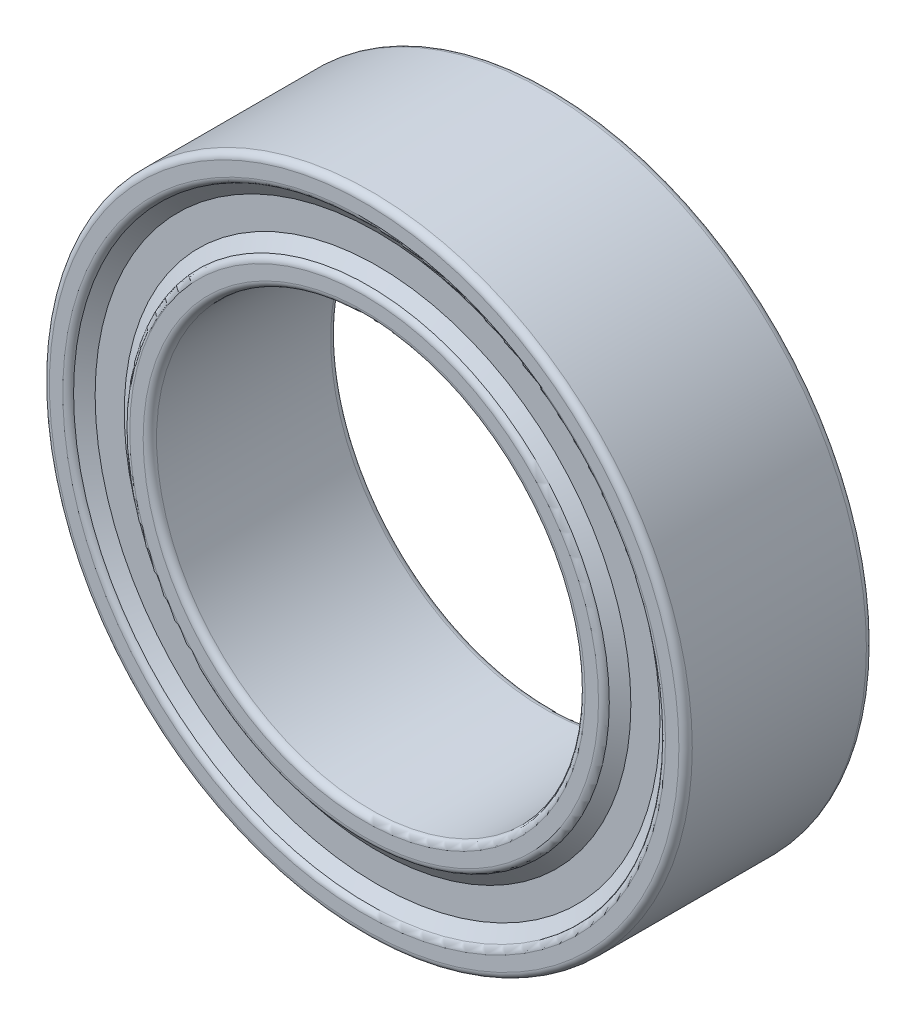
ISO-10303-21;
HEADER;
FILE_DESCRIPTION(('STEP AP214'),'2;1');
FILE_NAME('part.step','',(''),(''),'','','');
FILE_SCHEMA(('AUTOMOTIVE_DESIGN { 1 0 10303 214 1 1 1 1 }'));
ENDSEC;
DATA;
#1=APPLICATION_CONTEXT('core data for automotive mechanical design processes');
#2=APPLICATION_PROTOCOL_DEFINITION('international standard','automotive_design',2000,#1);
#3=PRODUCT_CONTEXT('',#1,'mechanical');
#4=PRODUCT('Part','Part','',(#3));
#5=PRODUCT_RELATED_PRODUCT_CATEGORY('part','',(#4));
#6=PRODUCT_DEFINITION_FORMATION('','',#4);
#7=PRODUCT_DEFINITION_CONTEXT('part definition',#1,'design');
#8=PRODUCT_DEFINITION('design','',#6,#7);
#9=PRODUCT_DEFINITION_SHAPE('','',#8);
#10=(LENGTH_UNIT() NAMED_UNIT(*) SI_UNIT(.MILLI.,.METRE.));
#11=(NAMED_UNIT(*) PLANE_ANGLE_UNIT() SI_UNIT($,.RADIAN.));
#12=(NAMED_UNIT(*) SI_UNIT($,.STERADIAN.) SOLID_ANGLE_UNIT());
#13=UNCERTAINTY_MEASURE_WITH_UNIT(LENGTH_MEASURE(1.E-05),#10,'distance_accuracy_value','');
#14=(GEOMETRIC_REPRESENTATION_CONTEXT(3) GLOBAL_UNCERTAINTY_ASSIGNED_CONTEXT((#13)) GLOBAL_UNIT_ASSIGNED_CONTEXT((#10,
#11,#12)) REPRESENTATION_CONTEXT('',''));
#15=CARTESIAN_POINT('',(0.,0.,0.));
#16=DIRECTION('',(0.,0.,1.));
#17=DIRECTION('',(1.,0.,0.));
#18=AXIS2_PLACEMENT_3D('',#15,#16,#17);
#19=CARTESIAN_POINT('',(0.,0.,0.));
#20=DIRECTION('',(0.,0.,1.));
#21=DIRECTION('',(1.,0.,0.));
#22=AXIS2_PLACEMENT_3D('',#19,#20,#21);
#23=PLANE('',#22);
#24=CARTESIAN_POINT('',(0.,0.,0.));
#25=DIRECTION('',(0.,0.,1.));
#26=DIRECTION('',(1.,0.,0.));
#27=AXIS2_PLACEMENT_3D('',#24,#25,#26);
#28=CIRCLE('',#27,4.375);
#29=CARTESIAN_POINT('',(4.375,0.,0.));
#30=VERTEX_POINT('',#29);
#31=EDGE_CURVE('E85',#30,#30,#28,.F.);
#32=ORIENTED_EDGE('',*,*,#31,.T.);
#33=EDGE_LOOP('',(#32));
#34=FACE_BOUND('',#33,.T.);
#35=CARTESIAN_POINT('',(0.,0.,0.));
#36=DIRECTION('',(0.,0.,1.));
#37=DIRECTION('',(1.,0.,0.));
#38=AXIS2_PLACEMENT_3D('',#35,#36,#37);
#39=CIRCLE('',#38,4.125);
#40=CARTESIAN_POINT('',(4.125,0.,0.));
#41=VERTEX_POINT('',#40);
#42=EDGE_CURVE('E88',#41,#41,#39,.T.);
#43=ORIENTED_EDGE('',*,*,#42,.T.);
#44=EDGE_LOOP('',(#43));
#45=FACE_BOUND('',#44,.T.);
#46=ADVANCED_FACE('F43',(#34,#45),#23,.F.);
#47=CARTESIAN_POINT('',(0.,0.,3.5));
#48=DIRECTION('',(0.,0.,1.));
#49=DIRECTION('',(1.,0.,0.));
#50=AXIS2_PLACEMENT_3D('',#47,#48,#49);
#51=PLANE('',#50);
#52=CARTESIAN_POINT('',(0.,0.,3.5));
#53=DIRECTION('',(0.,0.,1.));
#54=DIRECTION('',(1.,0.,0.));
#55=AXIS2_PLACEMENT_3D('',#52,#53,#54);
#56=CIRCLE('',#55,4.375);
#57=CARTESIAN_POINT('',(4.375,0.,3.5));
#58=VERTEX_POINT('',#57);
#59=EDGE_CURVE('E112',#58,#58,#56,.T.);
#60=ORIENTED_EDGE('',*,*,#59,.T.);
#61=EDGE_LOOP('',(#60));
#62=FACE_BOUND('',#61,.T.);
#63=CARTESIAN_POINT('',(0.,0.,3.5));
#64=DIRECTION('',(0.,0.,1.));
#65=DIRECTION('',(1.,0.,0.));
#66=AXIS2_PLACEMENT_3D('',#63,#64,#65);
#67=CIRCLE('',#66,4.125);
#68=CARTESIAN_POINT('',(4.125,0.,3.5));
#69=VERTEX_POINT('',#68);
#70=EDGE_CURVE('E115',#69,#69,#67,.F.);
#71=ORIENTED_EDGE('',*,*,#70,.T.);
#72=EDGE_LOOP('',(#71));
#73=FACE_BOUND('',#72,.T.);
#74=ADVANCED_FACE('F119',(#62,#73),#51,.T.);
#75=CARTESIAN_POINT('',(0.,0.,3.5));
#76=DIRECTION('',(0.,0.,1.));
#77=DIRECTION('',(1.,0.,0.));
#78=AXIS2_PLACEMENT_3D('',#75,#76,#77);
#79=CIRCLE('',#78,5.875);
#80=CARTESIAN_POINT('',(5.875,0.,3.5));
#81=VERTEX_POINT('',#80);
#82=EDGE_CURVE('E100',#81,#81,#79,.T.);
#83=ORIENTED_EDGE('',*,*,#82,.T.);
#84=EDGE_LOOP('',(#83));
#85=FACE_BOUND('',#84,.T.);
#86=CARTESIAN_POINT('',(0.,0.,3.5));
#87=DIRECTION('',(0.,0.,1.));
#88=DIRECTION('',(1.,0.,0.));
#89=AXIS2_PLACEMENT_3D('',#86,#87,#88);
#90=CIRCLE('',#89,5.625);
#91=CARTESIAN_POINT('',(5.625,0.,3.5));
#92=VERTEX_POINT('',#91);
#93=EDGE_CURVE('E103',#92,#92,#90,.F.);
#94=ORIENTED_EDGE('',*,*,#93,.T.);
#95=EDGE_LOOP('',(#94));
#96=FACE_BOUND('',#95,.T.);
#97=ADVANCED_FACE('F152',(#85,#96),#51,.T.);
#98=CARTESIAN_POINT('',(0.,0.,0.));
#99=DIRECTION('',(0.,0.,1.));
#100=DIRECTION('',(1.,0.,0.));
#101=AXIS2_PLACEMENT_3D('',#98,#99,#100);
#102=CIRCLE('',#101,5.875);
#103=CARTESIAN_POINT('',(5.875,0.,0.));
#104=VERTEX_POINT('',#103);
#105=EDGE_CURVE('E79',#104,#104,#102,.F.);
#106=ORIENTED_EDGE('',*,*,#105,.T.);
#107=EDGE_LOOP('',(#106));
#108=FACE_BOUND('',#107,.T.);
#109=CARTESIAN_POINT('',(0.,0.,0.));
#110=DIRECTION('',(0.,0.,1.));
#111=DIRECTION('',(1.,0.,0.));
#112=AXIS2_PLACEMENT_3D('',#109,#110,#111);
#113=CIRCLE('',#112,5.625);
#114=CARTESIAN_POINT('',(5.625,0.,0.));
#115=VERTEX_POINT('',#114);
#116=EDGE_CURVE('E82',#115,#115,#113,.T.);
#117=ORIENTED_EDGE('',*,*,#116,.T.);
#118=EDGE_LOOP('',(#117));
#119=FACE_BOUND('',#118,.T.);
#120=ADVANCED_FACE('F148',(#108,#119),#23,.F.);
#121=CARTESIAN_POINT('',(0.,0.,3.5));
#122=DIRECTION('',(0.,0.,-1.));
#123=DIRECTION('',(-1.,0.,0.));
#124=AXIS2_PLACEMENT_3D('',#121,#122,#123);
#125=CYLINDRICAL_SURFACE('',#124,6.);
#126=CARTESIAN_POINT('',(0.,0.,3.375));
#127=DIRECTION('',(0.,0.,1.));
#128=DIRECTION('',(1.,0.,0.));
#129=AXIS2_PLACEMENT_3D('',#126,#127,#128);
#130=CIRCLE('',#129,6.);
#131=CARTESIAN_POINT('',(6.,0.,3.375));
#132=VERTEX_POINT('',#131);
#133=EDGE_CURVE('E94',#132,#132,#130,.F.);
#134=ORIENTED_EDGE('',*,*,#133,.T.);
#135=EDGE_LOOP('',(#134));
#136=FACE_BOUND('',#135,.T.);
#137=CARTESIAN_POINT('',(0.,0.,0.125));
#138=DIRECTION('',(0.,0.,1.));
#139=DIRECTION('',(1.,0.,0.));
#140=AXIS2_PLACEMENT_3D('',#137,#138,#139);
#141=CIRCLE('',#140,6.);
#142=CARTESIAN_POINT('',(6.,0.,0.125));
#143=VERTEX_POINT('',#142);
#144=EDGE_CURVE('E97',#143,#143,#141,.T.);
#145=ORIENTED_EDGE('',*,*,#144,.T.);
#146=EDGE_LOOP('',(#145));
#147=FACE_BOUND('',#146,.T.);
#148=ADVANCED_FACE('F133',(#136,#147),#125,.T.);
#149=CARTESIAN_POINT('',(0.,0.,3.5));
#150=DIRECTION('',(0.,0.,-1.));
#151=DIRECTION('',(-1.,0.,0.));
#152=AXIS2_PLACEMENT_3D('',#149,#150,#151);
#153=CYLINDRICAL_SURFACE('',#152,4.);
#154=CARTESIAN_POINT('',(0.,0.,3.375));
#155=DIRECTION('',(0.,0.,1.));
#156=DIRECTION('',(1.,0.,0.));
#157=AXIS2_PLACEMENT_3D('',#154,#155,#156);
#158=CIRCLE('',#157,4.);
#159=CARTESIAN_POINT('',(4.,0.,3.375));
#160=VERTEX_POINT('',#159);
#161=EDGE_CURVE('E106',#160,#160,#158,.T.);
#162=ORIENTED_EDGE('',*,*,#161,.T.);
#163=EDGE_LOOP('',(#162));
#164=FACE_BOUND('',#163,.T.);
#165=CARTESIAN_POINT('',(0.,0.,0.125));
#166=DIRECTION('',(0.,0.,1.));
#167=DIRECTION('',(1.,0.,0.));
#168=AXIS2_PLACEMENT_3D('',#165,#166,#167);
#169=CIRCLE('',#168,4.);
#170=CARTESIAN_POINT('',(4.,0.,0.125));
#171=VERTEX_POINT('',#170);
#172=EDGE_CURVE('E109',#171,#171,#169,.F.);
#173=ORIENTED_EDGE('',*,*,#172,.T.);
#174=EDGE_LOOP('',(#173));
#175=FACE_BOUND('',#174,.T.);
#176=ADVANCED_FACE('F129',(#164,#175),#153,.F.);
#177=CARTESIAN_POINT('',(0.,0.,3.25));
#178=DIRECTION('',(0.,0.,1.));
#179=DIRECTION('',(1.,0.,0.));
#180=AXIS2_PLACEMENT_3D('',#177,#178,#179);
#181=PLANE('',#180);
#182=CARTESIAN_POINT('',(0.,0.,3.25));
#183=DIRECTION('',(0.,0.,1.));
#184=DIRECTION('',(1.,0.,0.));
#185=AXIS2_PLACEMENT_3D('',#182,#183,#184);
#186=CIRCLE('',#185,5.27144660940672);
#187=CARTESIAN_POINT('',(5.27144660940672,0.,3.25));
#188=VERTEX_POINT('',#187);
#189=EDGE_CURVE('E70',#188,#188,#186,.T.);
#190=ORIENTED_EDGE('',*,*,#189,.T.);
#191=EDGE_LOOP('',(#190));
#192=FACE_BOUND('',#191,.T.);
#193=CARTESIAN_POINT('',(0.,0.,3.25));
#194=DIRECTION('',(0.,0.,1.));
#195=DIRECTION('',(1.,0.,0.));
#196=AXIS2_PLACEMENT_3D('',#193,#194,#195);
#197=CIRCLE('',#196,4.72855339059327);
#198=CARTESIAN_POINT('',(4.72855339059327,0.,3.25));
#199=VERTEX_POINT('',#198);
#200=EDGE_CURVE('E73',#199,#199,#197,.F.);
#201=ORIENTED_EDGE('',*,*,#200,.T.);
#202=EDGE_LOOP('',(#201));
#203=FACE_BOUND('',#202,.T.);
#204=ADVANCED_FACE('F132',(#192,#203),#181,.T.);
#205=CARTESIAN_POINT('',(0.,0.,0.5));
#206=DIRECTION('',(0.,0.,1.));
#207=DIRECTION('',(1.,0.,0.));
#208=AXIS2_PLACEMENT_3D('',#205,#206,#207);
#209=PLANE('',#208);
#210=CARTESIAN_POINT('',(0.,0.,0.5));
#211=DIRECTION('',(0.,0.,1.));
#212=DIRECTION('',(1.,0.,0.));
#213=AXIS2_PLACEMENT_3D('',#210,#211,#212);
#214=CIRCLE('',#213,4.75);
#215=CARTESIAN_POINT('',(4.75,0.,0.5));
#216=VERTEX_POINT('',#215);
#217=EDGE_CURVE('E55',#216,#216,#214,.T.);
#218=ORIENTED_EDGE('',*,*,#217,.T.);
#219=EDGE_LOOP('',(#218));
#220=FACE_BOUND('',#219,.T.);
#221=CARTESIAN_POINT('',(0.,0.,0.5));
#222=DIRECTION('',(0.,0.,1.));
#223=DIRECTION('',(1.,0.,0.));
#224=AXIS2_PLACEMENT_3D('',#221,#222,#223);
#225=CIRCLE('',#224,5.25);
#226=CARTESIAN_POINT('',(5.25,0.,0.5));
#227=VERTEX_POINT('',#226);
#228=EDGE_CURVE('E59',#227,#227,#225,.F.);
#229=ORIENTED_EDGE('',*,*,#228,.T.);
#230=EDGE_LOOP('',(#229));
#231=FACE_BOUND('',#230,.T.);
#232=ADVANCED_FACE('F206',(#220,#231),#209,.F.);
#233=CARTESIAN_POINT('',(0.,0.,0.5));
#234=DIRECTION('',(0.,0.,-1.));
#235=DIRECTION('',(-1.,0.,0.));
#236=AXIS2_PLACEMENT_3D('',#233,#234,#235);
#237=CYLINDRICAL_SURFACE('',#236,5.5);
#238=CARTESIAN_POINT('',(0.,0.,0.249999999999996));
#239=DIRECTION('',(0.,0.,1.));
#240=DIRECTION('',(1.,0.,0.));
#241=AXIS2_PLACEMENT_3D('',#238,#239,#240);
#242=CIRCLE('',#241,5.5);
#243=CARTESIAN_POINT('',(5.5,0.,0.249999999999996));
#244=VERTEX_POINT('',#243);
#245=EDGE_CURVE('E10',#244,#244,#242,.T.);
#246=ORIENTED_EDGE('',*,*,#245,.T.);
#247=EDGE_LOOP('',(#246));
#248=FACE_BOUND('',#247,.T.);
#249=CARTESIAN_POINT('',(0.,0.,0.125));
#250=DIRECTION('',(0.,0.,1.));
#251=DIRECTION('',(1.,0.,0.));
#252=AXIS2_PLACEMENT_3D('',#249,#250,#251);
#253=CIRCLE('',#252,5.5);
#254=CARTESIAN_POINT('',(5.5,0.,0.125));
#255=VERTEX_POINT('',#254);
#256=EDGE_CURVE('E76',#255,#255,#253,.F.);
#257=ORIENTED_EDGE('',*,*,#256,.T.);
#258=EDGE_LOOP('',(#257));
#259=FACE_BOUND('',#258,.T.);
#260=ADVANCED_FACE('F209',(#248,#259),#237,.F.);
#261=CARTESIAN_POINT('',(0.,0.,0.5));
#262=DIRECTION('',(0.,0.,-1.));
#263=DIRECTION('',(-1.,0.,0.));
#264=AXIS2_PLACEMENT_3D('',#261,#262,#263);
#265=CYLINDRICAL_SURFACE('',#264,4.5);
#266=CARTESIAN_POINT('',(0.,0.,0.250000000000002));
#267=DIRECTION('',(0.,0.,1.));
#268=DIRECTION('',(1.,0.,0.));
#269=AXIS2_PLACEMENT_3D('',#266,#267,#268);
#270=CIRCLE('',#269,4.5);
#271=CARTESIAN_POINT('',(4.5,0.,0.250000000000002));
#272=VERTEX_POINT('',#271);
#273=EDGE_CURVE('E51',#272,#272,#270,.F.);
#274=ORIENTED_EDGE('',*,*,#273,.T.);
#275=EDGE_LOOP('',(#274));
#276=FACE_BOUND('',#275,.T.);
#277=CARTESIAN_POINT('',(0.,0.,0.125));
#278=DIRECTION('',(0.,0.,1.));
#279=DIRECTION('',(1.,0.,0.));
#280=AXIS2_PLACEMENT_3D('',#277,#278,#279);
#281=CIRCLE('',#280,4.5);
#282=CARTESIAN_POINT('',(4.5,0.,0.125));
#283=VERTEX_POINT('',#282);
#284=EDGE_CURVE('E91',#283,#283,#281,.T.);
#285=ORIENTED_EDGE('',*,*,#284,.T.);
#286=EDGE_LOOP('',(#285));
#287=FACE_BOUND('',#286,.T.);
#288=ADVANCED_FACE('F217',(#276,#287),#265,.T.);
#289=CARTESIAN_POINT('',(0.,0.,3.375));
#290=DIRECTION('',(0.,0.,1.));
#291=DIRECTION('',(1.,0.,0.));
#292=AXIS2_PLACEMENT_3D('',#289,#290,#291);
#293=TOROIDAL_SURFACE('',#292,4.375,0.125);
#294=CARTESIAN_POINT('',(0.,0.,3.41666666666666));
#295=DIRECTION('',(0.,0.,-1.));
#296=DIRECTION('',(-1.,0.,0.));
#297=AXIS2_PLACEMENT_3D('',#294,#295,#296);
#298=CIRCLE('',#297,4.49285113019774);
#299=CARTESIAN_POINT('',(-4.49285113019774,0.,3.41666666666666));
#300=VERTEX_POINT('',#299);
#301=EDGE_CURVE('E64',#300,#300,#298,.F.);
#302=ORIENTED_EDGE('',*,*,#301,.T.);
#303=EDGE_LOOP('',(#302));
#304=FACE_BOUND('',#303,.T.);
#305=ORIENTED_EDGE('',*,*,#59,.F.);
#306=EDGE_LOOP('',(#305));
#307=FACE_BOUND('',#306,.T.);
#308=ADVANCED_FACE('F125',(#304,#307),#293,.T.);
#309=CARTESIAN_POINT('',(0.,0.,3.375));
#310=DIRECTION('',(0.,0.,1.));
#311=DIRECTION('',(1.,0.,0.));
#312=AXIS2_PLACEMENT_3D('',#309,#310,#311);
#313=TOROIDAL_SURFACE('',#312,4.125,0.125);
#314=ORIENTED_EDGE('',*,*,#70,.F.);
#315=EDGE_LOOP('',(#314));
#316=FACE_BOUND('',#315,.T.);
#317=ORIENTED_EDGE('',*,*,#161,.F.);
#318=EDGE_LOOP('',(#317));
#319=FACE_BOUND('',#318,.T.);
#320=ADVANCED_FACE('F121',(#316,#319),#313,.T.);
#321=CARTESIAN_POINT('',(0.,0.,3.375));
#322=DIRECTION('',(0.,0.,1.));
#323=DIRECTION('',(1.,0.,0.));
#324=AXIS2_PLACEMENT_3D('',#321,#322,#323);
#325=TOROIDAL_SURFACE('',#324,5.875,0.125);
#326=ORIENTED_EDGE('',*,*,#133,.F.);
#327=EDGE_LOOP('',(#326));
#328=FACE_BOUND('',#327,.T.);
#329=ORIENTED_EDGE('',*,*,#82,.F.);
#330=EDGE_LOOP('',(#329));
#331=FACE_BOUND('',#330,.T.);
#332=ADVANCED_FACE('F124',(#328,#331),#325,.T.);
#333=CARTESIAN_POINT('',(0.,0.,3.375));
#334=DIRECTION('',(0.,0.,1.));
#335=DIRECTION('',(1.,0.,0.));
#336=AXIS2_PLACEMENT_3D('',#333,#334,#335);
#337=TOROIDAL_SURFACE('',#336,5.625,0.125);
#338=CARTESIAN_POINT('',(0.,0.,3.41666666666669));
#339=DIRECTION('',(0.,0.,-1.));
#340=DIRECTION('',(-1.,0.,0.));
#341=AXIS2_PLACEMENT_3D('',#338,#339,#340);
#342=CIRCLE('',#341,5.50714886980216);
#343=CARTESIAN_POINT('',(-5.50714886980216,0.,3.41666666666669));
#344=VERTEX_POINT('',#343);
#345=EDGE_CURVE('E67',#344,#344,#342,.T.);
#346=ORIENTED_EDGE('',*,*,#345,.T.);
#347=EDGE_LOOP('',(#346));
#348=FACE_BOUND('',#347,.T.);
#349=ORIENTED_EDGE('',*,*,#93,.F.);
#350=EDGE_LOOP('',(#349));
#351=FACE_BOUND('',#350,.T.);
#352=ADVANCED_FACE('F232',(#348,#351),#337,.T.);
#353=CARTESIAN_POINT('',(0.,0.,0.125));
#354=DIRECTION('',(0.,0.,1.));
#355=DIRECTION('',(1.,0.,0.));
#356=AXIS2_PLACEMENT_3D('',#353,#354,#355);
#357=TOROIDAL_SURFACE('',#356,4.375,0.125);
#358=ORIENTED_EDGE('',*,*,#31,.F.);
#359=EDGE_LOOP('',(#358));
#360=FACE_BOUND('',#359,.T.);
#361=ORIENTED_EDGE('',*,*,#284,.F.);
#362=EDGE_LOOP('',(#361));
#363=FACE_BOUND('',#362,.T.);
#364=ADVANCED_FACE('F141',(#360,#363),#357,.T.);
#365=CARTESIAN_POINT('',(0.,0.,0.125));
#366=DIRECTION('',(0.,0.,1.));
#367=DIRECTION('',(1.,0.,0.));
#368=AXIS2_PLACEMENT_3D('',#365,#366,#367);
#369=TOROIDAL_SURFACE('',#368,4.125,0.125);
#370=ORIENTED_EDGE('',*,*,#172,.F.);
#371=EDGE_LOOP('',(#370));
#372=FACE_BOUND('',#371,.T.);
#373=ORIENTED_EDGE('',*,*,#42,.F.);
#374=EDGE_LOOP('',(#373));
#375=FACE_BOUND('',#374,.T.);
#376=ADVANCED_FACE('F137',(#372,#375),#369,.T.);
#377=CARTESIAN_POINT('',(0.,0.,0.125));
#378=DIRECTION('',(0.,0.,1.));
#379=DIRECTION('',(1.,0.,0.));
#380=AXIS2_PLACEMENT_3D('',#377,#378,#379);
#381=TOROIDAL_SURFACE('',#380,5.875,0.125);
#382=ORIENTED_EDGE('',*,*,#105,.F.);
#383=EDGE_LOOP('',(#382));
#384=FACE_BOUND('',#383,.T.);
#385=ORIENTED_EDGE('',*,*,#144,.F.);
#386=EDGE_LOOP('',(#385));
#387=FACE_BOUND('',#386,.T.);
#388=ADVANCED_FACE('F140',(#384,#387),#381,.T.);
#389=CARTESIAN_POINT('',(0.,0.,0.125));
#390=DIRECTION('',(0.,0.,1.));
#391=DIRECTION('',(1.,0.,0.));
#392=AXIS2_PLACEMENT_3D('',#389,#390,#391);
#393=TOROIDAL_SURFACE('',#392,5.625,0.125);
#394=ORIENTED_EDGE('',*,*,#256,.F.);
#395=EDGE_LOOP('',(#394));
#396=FACE_BOUND('',#395,.T.);
#397=ORIENTED_EDGE('',*,*,#116,.F.);
#398=EDGE_LOOP('',(#397));
#399=FACE_BOUND('',#398,.T.);
#400=ADVANCED_FACE('F168',(#396,#399),#393,.T.);
#401=CARTESIAN_POINT('',(0.,0.,3.25));
#402=DIRECTION('',(0.,0.,1.));
#403=DIRECTION('',(1.,0.,0.));
#404=AXIS2_PLACEMENT_3D('',#401,#402,#403);
#405=CONICAL_SURFACE('',#404,5.27144660940672,0.955316618124518);
#406=ORIENTED_EDGE('',*,*,#345,.F.);
#407=EDGE_LOOP('',(#406));
#408=FACE_BOUND('',#407,.T.);
#409=ORIENTED_EDGE('',*,*,#189,.F.);
#410=EDGE_LOOP('',(#409));
#411=FACE_BOUND('',#410,.T.);
#412=ADVANCED_FACE('F170',(#408,#411),#405,.F.);
#413=CARTESIAN_POINT('',(0.,0.,3.41666666666667));
#414=DIRECTION('',(0.,0.,-1.));
#415=DIRECTION('',(-1.,0.,0.));
#416=AXIS2_PLACEMENT_3D('',#413,#414,#415);
#417=CONICAL_SURFACE('',#416,4.49285113019776,0.955316618124508);
#418=ORIENTED_EDGE('',*,*,#200,.F.);
#419=EDGE_LOOP('',(#418));
#420=FACE_BOUND('',#419,.T.);
#421=ORIENTED_EDGE('',*,*,#301,.F.);
#422=EDGE_LOOP('',(#421));
#423=FACE_BOUND('',#422,.T.);
#424=ADVANCED_FACE('F178',(#420,#423),#417,.T.);
#425=CARTESIAN_POINT('',(0.,0.,0.5));
#426=DIRECTION('',(0.,0.,1.));
#427=DIRECTION('',(1.,0.,0.));
#428=AXIS2_PLACEMENT_3D('',#425,#426,#427);
#429=CONICAL_SURFACE('',#428,4.75,0.785398163397454);
#430=ORIENTED_EDGE('',*,*,#273,.F.);
#431=EDGE_LOOP('',(#430));
#432=FACE_BOUND('',#431,.T.);
#433=ORIENTED_EDGE('',*,*,#217,.F.);
#434=EDGE_LOOP('',(#433));
#435=FACE_BOUND('',#434,.T.);
#436=ADVANCED_FACE('F193',(#432,#435),#429,.T.);
#437=CARTESIAN_POINT('',(0.,0.,0.249999999999996));
#438=DIRECTION('',(0.,0.,-1.));
#439=DIRECTION('',(-1.,0.,0.));
#440=AXIS2_PLACEMENT_3D('',#437,#438,#439);
#441=CONICAL_SURFACE('',#440,5.5,0.785398163397441);
#442=ORIENTED_EDGE('',*,*,#228,.F.);
#443=EDGE_LOOP('',(#442));
#444=FACE_BOUND('',#443,.T.);
#445=ORIENTED_EDGE('',*,*,#245,.F.);
#446=EDGE_LOOP('',(#445));
#447=FACE_BOUND('',#446,.T.);
#448=ADVANCED_FACE('F46',(#444,#447),#441,.F.);
#449=CLOSED_SHELL('',(#46,#74,#97,#120,#148,#176,#204,#232,#260,#288,#308,#320,#332,#352,#364,
#376,#388,#400,#412,#424,#436,#448));
#450=MANIFOLD_SOLID_BREP('B2',#449);
#451=ADVANCED_BREP_SHAPE_REPRESENTATION('',(#18,#450),#14);
#452=SHAPE_DEFINITION_REPRESENTATION(#9,#451);
ENDSEC;
END-ISO-10303-21;
